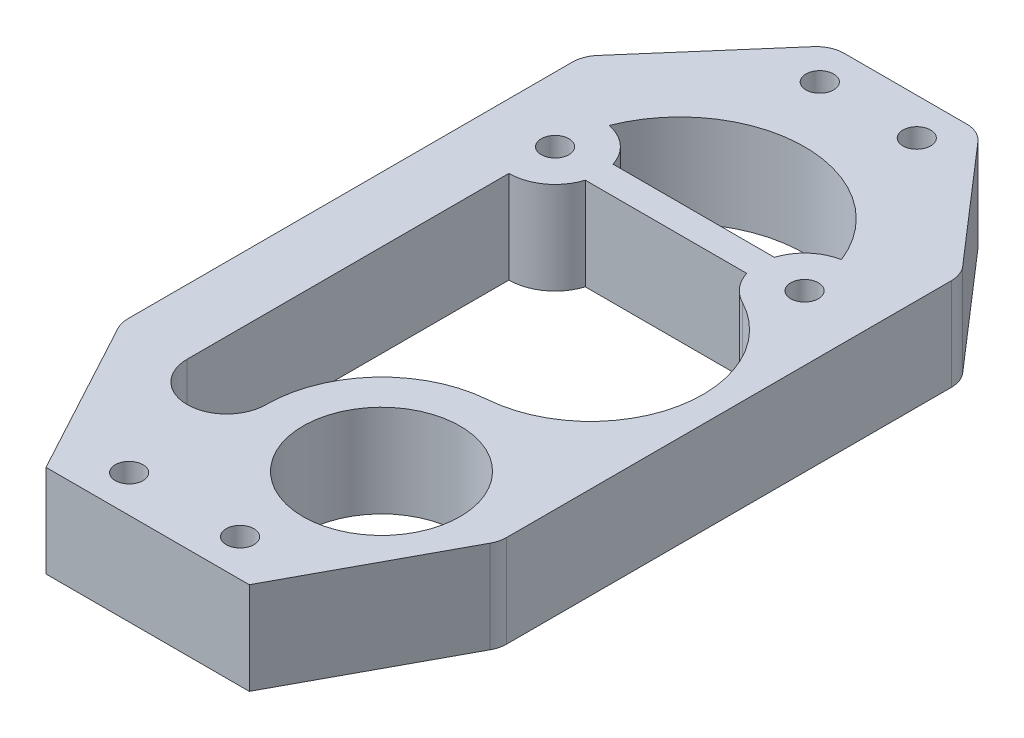
ISO-10303-21;
HEADER;
FILE_DESCRIPTION(('STEP AP214'),'2;1');
FILE_NAME('part.step','',(''),(''),'','','');
FILE_SCHEMA(('AUTOMOTIVE_DESIGN { 1 0 10303 214 1 1 1 1 }'));
ENDSEC;
DATA;
#1=APPLICATION_CONTEXT('core data for automotive mechanical design processes');
#2=APPLICATION_PROTOCOL_DEFINITION('international standard','automotive_design',2000,#1);
#3=PRODUCT_CONTEXT('',#1,'mechanical');
#4=PRODUCT('Part','Part','',(#3));
#5=PRODUCT_RELATED_PRODUCT_CATEGORY('part','',(#4));
#6=PRODUCT_DEFINITION_FORMATION('','',#4);
#7=PRODUCT_DEFINITION_CONTEXT('part definition',#1,'design');
#8=PRODUCT_DEFINITION('design','',#6,#7);
#9=PRODUCT_DEFINITION_SHAPE('','',#8);
#10=(LENGTH_UNIT() NAMED_UNIT(*) SI_UNIT(.MILLI.,.METRE.));
#11=(NAMED_UNIT(*) PLANE_ANGLE_UNIT() SI_UNIT($,.RADIAN.));
#12=(NAMED_UNIT(*) SI_UNIT($,.STERADIAN.) SOLID_ANGLE_UNIT());
#13=UNCERTAINTY_MEASURE_WITH_UNIT(LENGTH_MEASURE(1.E-05),#10,'distance_accuracy_value','');
#14=(GEOMETRIC_REPRESENTATION_CONTEXT(3) GLOBAL_UNCERTAINTY_ASSIGNED_CONTEXT((#13)) GLOBAL_UNIT_ASSIGNED_CONTEXT((#10,
#11,#12)) REPRESENTATION_CONTEXT('',''));
#15=CARTESIAN_POINT('',(0.,0.,0.));
#16=DIRECTION('',(0.,0.,1.));
#17=DIRECTION('',(1.,0.,0.));
#18=AXIS2_PLACEMENT_3D('',#15,#16,#17);
#19=CARTESIAN_POINT('',(0.,5.,0.));
#20=DIRECTION('',(0.,-1.,0.));
#21=DIRECTION('',(0.,0.,-1.));
#22=AXIS2_PLACEMENT_3D('',#19,#20,#21);
#23=PLANE('',#22);
#24=CARTESIAN_POINT('',(13.5,5.,0.));
#25=DIRECTION('',(0.,1.,0.));
#26=DIRECTION('',(0.,0.,1.));
#27=AXIS2_PLACEMENT_3D('',#24,#25,#26);
#28=CIRCLE('',#27,1.5);
#29=CARTESIAN_POINT('',(13.5,5.,1.5));
#30=VERTEX_POINT('',#29);
#31=EDGE_CURVE('E272',#30,#30,#28,.T.);
#32=ORIENTED_EDGE('',*,*,#31,.F.);
#33=EDGE_LOOP('',(#32));
#34=FACE_BOUND('',#33,.T.);
#35=CARTESIAN_POINT('',(-13.5,5.,0.));
#36=DIRECTION('',(0.,1.,0.));
#37=DIRECTION('',(0.,0.,1.));
#38=AXIS2_PLACEMENT_3D('',#35,#36,#37);
#39=CIRCLE('',#38,1.5);
#40=CARTESIAN_POINT('',(-13.5,5.,1.5));
#41=VERTEX_POINT('',#40);
#42=EDGE_CURVE('E278',#41,#41,#39,.T.);
#43=ORIENTED_EDGE('',*,*,#42,.F.);
#44=EDGE_LOOP('',(#43));
#45=FACE_BOUND('',#44,.T.);
#46=CARTESIAN_POINT('',(13.5,5.,0.));
#47=DIRECTION('',(0.,-1.,0.));
#48=DIRECTION('',(0.,0.,1.));
#49=AXIS2_PLACEMENT_3D('',#46,#47,#48);
#50=CIRCLE('',#49,5.);
#51=CARTESIAN_POINT('',(8.73030399291527,5.,-1.5));
#52=VERTEX_POINT('',#51);
#53=CARTESIAN_POINT('',(12.5740740740741,5.,-4.91351820793393));
#54=VERTEX_POINT('',#53);
#55=EDGE_CURVE('E284',#52,#54,#50,.T.);
#56=ORIENTED_EDGE('',*,*,#55,.F.);
#57=DIRECTION('',(1.,0.,0.));
#58=VECTOR('',#57,1.);
#59=CARTESIAN_POINT('',(8.73030399291527,5.,-1.5));
#60=LINE('',#59,#58);
#61=CARTESIAN_POINT('',(-8.73030399291527,5.,-1.5));
#62=VERTEX_POINT('',#61);
#63=EDGE_CURVE('E292',#62,#52,#60,.T.);
#64=ORIENTED_EDGE('',*,*,#63,.F.);
#65=CARTESIAN_POINT('',(-13.5,5.,0.));
#66=DIRECTION('',(0.,-1.,0.));
#67=DIRECTION('',(0.,0.,1.));
#68=AXIS2_PLACEMENT_3D('',#65,#66,#67);
#69=CIRCLE('',#68,5.);
#70=CARTESIAN_POINT('',(-12.5740740740741,5.,-4.91351820793393));
#71=VERTEX_POINT('',#70);
#72=EDGE_CURVE('E289',#71,#62,#69,.T.);
#73=ORIENTED_EDGE('',*,*,#72,.F.);
#74=CARTESIAN_POINT('',(0.,5.,0.));
#75=DIRECTION('',(0.,1.,0.));
#76=DIRECTION('',(0.,0.,1.));
#77=AXIS2_PLACEMENT_3D('',#74,#75,#76);
#78=CIRCLE('',#77,13.5);
#79=EDGE_CURVE('E286',#54,#71,#78,.T.);
#80=ORIENTED_EDGE('',*,*,#79,.F.);
#81=EDGE_LOOP('',(#56,#64,#73,#80));
#82=FACE_BOUND('',#81,.T.);
#83=DIRECTION('',(0.,0.,1.));
#84=VECTOR('',#83,1.);
#85=CARTESIAN_POINT('',(-20.5,5.,-10.));
#86=LINE('',#85,#84);
#87=CARTESIAN_POINT('',(-20.5,5.,-8.87956217000711));
#88=VERTEX_POINT('',#87);
#89=CARTESIAN_POINT('',(-20.5,5.,39.2420155495152));
#90=VERTEX_POINT('',#89);
#91=EDGE_CURVE('E356',#88,#90,#86,.T.);
#92=ORIENTED_EDGE('',*,*,#91,.T.);
#93=CARTESIAN_POINT('',(-17.5,5.,39.2420155495152));
#94=DIRECTION('',(0.,-1.,0.));
#95=DIRECTION('',(0.,0.,-1.));
#96=AXIS2_PLACEMENT_3D('',#93,#94,#95);
#97=CIRCLE('',#96,3.);
#98=CARTESIAN_POINT('',(-20.1399573860197,5.,40.6670155495152));
#99=VERTEX_POINT('',#98);
#100=EDGE_CURVE('E416',#90,#99,#97,.F.);
#101=ORIENTED_EDGE('',*,*,#100,.T.);
#102=DIRECTION('',(0.475,0.,0.879985795339902));
#103=VECTOR('',#102,1.);
#104=CARTESIAN_POINT('',(-20.5,5.,40.));
#105=LINE('',#104,#103);
#106=CARTESIAN_POINT('',(-11.,5.,57.5997159067981));
#107=VERTEX_POINT('',#106);
#108=EDGE_CURVE('E359',#99,#107,#105,.T.);
#109=ORIENTED_EDGE('',*,*,#108,.T.);
#110=DIRECTION('',(1.,0.,0.));
#111=VECTOR('',#110,1.);
#112=CARTESIAN_POINT('',(-11.,5.,57.5997159067981));
#113=LINE('',#112,#111);
#114=CARTESIAN_POINT('',(11.,5.,57.5997159067981));
#115=VERTEX_POINT('',#114);
#116=EDGE_CURVE('E339',#107,#115,#113,.T.);
#117=ORIENTED_EDGE('',*,*,#116,.T.);
#118=DIRECTION('',(0.475,0.,-0.879985795339902));
#119=VECTOR('',#118,1.);
#120=CARTESIAN_POINT('',(20.5,5.,40.));
#121=LINE('',#120,#119);
#122=CARTESIAN_POINT('',(20.1399573860197,5.,40.6670155495152));
#123=VERTEX_POINT('',#122);
#124=EDGE_CURVE('E342',#115,#123,#121,.T.);
#125=ORIENTED_EDGE('',*,*,#124,.T.);
#126=CARTESIAN_POINT('',(17.5,5.,39.2420155495152));
#127=DIRECTION('',(0.,-1.,0.));
#128=DIRECTION('',(0.,0.,-1.));
#129=AXIS2_PLACEMENT_3D('',#126,#127,#128);
#130=CIRCLE('',#129,3.);
#131=CARTESIAN_POINT('',(20.5,5.,39.2420155495152));
#132=VERTEX_POINT('',#131);
#133=EDGE_CURVE('E407',#123,#132,#130,.F.);
#134=ORIENTED_EDGE('',*,*,#133,.T.);
#135=DIRECTION('',(0.,0.,-1.));
#136=VECTOR('',#135,1.);
#137=CARTESIAN_POINT('',(20.5,5.,-10.));
#138=LINE('',#137,#136);
#139=CARTESIAN_POINT('',(20.5,5.,-8.87956217000711));
#140=VERTEX_POINT('',#139);
#141=EDGE_CURVE('E346',#132,#140,#138,.T.);
#142=ORIENTED_EDGE('',*,*,#141,.T.);
#143=CARTESIAN_POINT('',(17.5,5.,-8.87956217000711));
#144=DIRECTION('',(0.,-1.,0.));
#145=DIRECTION('',(0.,0.,-1.));
#146=AXIS2_PLACEMENT_3D('',#143,#144,#145);
#147=CIRCLE('',#146,3.);
#148=CARTESIAN_POINT('',(19.7655284444291,5.,-10.8461279246878));
#149=VERTEX_POINT('',#148);
#150=EDGE_CURVE('E409',#140,#149,#147,.F.);
#151=ORIENTED_EDGE('',*,*,#150,.T.);
#152=DIRECTION('',(-0.655521918226887,0.,-0.755176148143029));
#153=VECTOR('',#152,1.);
#154=CARTESIAN_POINT('',(8.,5.,-24.400284093202));
#155=LINE('',#154,#153);
#156=CARTESIAN_POINT('',(8.89706064011543,5.,-23.3668498478826));
#157=VERTEX_POINT('',#156);
#158=EDGE_CURVE('E349',#149,#157,#155,.T.);
#159=ORIENTED_EDGE('',*,*,#158,.T.);
#160=CARTESIAN_POINT('',(6.63153219568634,5.,-21.400284093202));
#161=DIRECTION('',(0.,-1.,0.));
#162=DIRECTION('',(0.,0.,-1.));
#163=AXIS2_PLACEMENT_3D('',#160,#161,#162);
#164=CIRCLE('',#163,3.);
#165=CARTESIAN_POINT('',(6.63153219568634,5.,-24.400284093202));
#166=VERTEX_POINT('',#165);
#167=EDGE_CURVE('E411',#157,#166,#164,.F.);
#168=ORIENTED_EDGE('',*,*,#167,.T.);
#169=DIRECTION('',(-1.,0.,0.));
#170=VECTOR('',#169,1.);
#171=CARTESIAN_POINT('',(8.,5.,-24.400284093202));
#172=LINE('',#171,#170);
#173=CARTESIAN_POINT('',(-6.63153219568634,5.,-24.400284093202));
#174=VERTEX_POINT('',#173);
#175=EDGE_CURVE('E352',#166,#174,#172,.T.);
#176=ORIENTED_EDGE('',*,*,#175,.T.);
#177=CARTESIAN_POINT('',(-6.63153219568634,5.,-21.400284093202));
#178=DIRECTION('',(0.,-1.,0.));
#179=DIRECTION('',(0.,0.,-1.));
#180=AXIS2_PLACEMENT_3D('',#177,#178,#179);
#181=CIRCLE('',#180,3.);
#182=CARTESIAN_POINT('',(-8.89706064011543,5.,-23.3668498478826));
#183=VERTEX_POINT('',#182);
#184=EDGE_CURVE('E59',#174,#183,#181,.F.);
#185=ORIENTED_EDGE('',*,*,#184,.T.);
#186=DIRECTION('',(-0.655521918226887,0.,0.755176148143029));
#187=VECTOR('',#186,1.);
#188=CARTESIAN_POINT('',(-8.,5.,-24.400284093202));
#189=LINE('',#188,#187);
#190=CARTESIAN_POINT('',(-19.7655284444291,5.,-10.8461279246878));
#191=VERTEX_POINT('',#190);
#192=EDGE_CURVE('E354',#183,#191,#189,.T.);
#193=ORIENTED_EDGE('',*,*,#192,.T.);
#194=CARTESIAN_POINT('',(-17.5,5.,-8.87956217000711));
#195=DIRECTION('',(0.,-1.,0.));
#196=DIRECTION('',(0.,0.,-1.));
#197=AXIS2_PLACEMENT_3D('',#194,#195,#196);
#198=CIRCLE('',#197,3.);
#199=EDGE_CURVE('E414',#191,#88,#198,.F.);
#200=ORIENTED_EDGE('',*,*,#199,.T.);
#201=EDGE_LOOP('',(#92,#101,#109,#117,#125,#134,#142,#151,#159,#168,#176,#185,#193,#200));
#202=FACE_BOUND('',#201,.T.);
#203=CARTESIAN_POINT('',(-5.25,5.,-20.3945458395131));
#204=DIRECTION('',(0.,1.,0.));
#205=DIRECTION('',(0.,0.,1.));
#206=AXIS2_PLACEMENT_3D('',#203,#204,#205);
#207=CIRCLE('',#206,1.5);
#208=CARTESIAN_POINT('',(-5.25,5.,-18.8945458395131));
#209=VERTEX_POINT('',#208);
#210=EDGE_CURVE('E333',#209,#209,#207,.T.);
#211=ORIENTED_EDGE('',*,*,#210,.F.);
#212=EDGE_LOOP('',(#211));
#213=FACE_BOUND('',#212,.T.);
#214=CARTESIAN_POINT('',(-6.,5.,53.5997159067981));
#215=DIRECTION('',(0.,1.,0.));
#216=DIRECTION('',(0.,0.,1.));
#217=AXIS2_PLACEMENT_3D('',#214,#215,#216);
#218=CIRCLE('',#217,1.5);
#219=CARTESIAN_POINT('',(-6.,5.,55.0997159067981));
#220=VERTEX_POINT('',#219);
#221=EDGE_CURVE('E327',#220,#220,#218,.T.);
#222=ORIENTED_EDGE('',*,*,#221,.F.);
#223=EDGE_LOOP('',(#222));
#224=FACE_BOUND('',#223,.T.);
#225=CARTESIAN_POINT('',(6.,5.,53.5997159067981));
#226=DIRECTION('',(0.,1.,0.));
#227=DIRECTION('',(0.,0.,-1.));
#228=AXIS2_PLACEMENT_3D('',#225,#226,#227);
#229=CIRCLE('',#228,1.5);
#230=CARTESIAN_POINT('',(6.,5.,52.0997159067981));
#231=VERTEX_POINT('',#230);
#232=EDGE_CURVE('E321',#231,#231,#229,.T.);
#233=ORIENTED_EDGE('',*,*,#232,.F.);
#234=EDGE_LOOP('',(#233));
#235=FACE_BOUND('',#234,.T.);
#236=CARTESIAN_POINT('',(5.25,5.,-20.3945458395131));
#237=DIRECTION('',(0.,1.,0.));
#238=DIRECTION('',(0.,0.,-1.));
#239=AXIS2_PLACEMENT_3D('',#236,#237,#238);
#240=CIRCLE('',#239,1.5);
#241=CARTESIAN_POINT('',(5.25,5.,-21.8945458395131));
#242=VERTEX_POINT('',#241);
#243=EDGE_CURVE('E315',#242,#242,#240,.T.);
#244=ORIENTED_EDGE('',*,*,#243,.F.);
#245=EDGE_LOOP('',(#244));
#246=FACE_BOUND('',#245,.T.);
#247=CARTESIAN_POINT('',(-9.23491832320444,5.,39.8174147720394));
#248=DIRECTION('',(0.,1.,0.));
#249=DIRECTION('',(0.,0.,1.));
#250=AXIS2_PLACEMENT_3D('',#247,#248,#249);
#251=CIRCLE('',#250,4.26508167679556);
#252=CARTESIAN_POINT('',(-13.5,5.,39.8174147720394));
#253=VERTEX_POINT('',#252);
#254=CARTESIAN_POINT('',(-4.96983664640887,5.,39.8174147720394));
#255=VERTEX_POINT('',#254);
#256=EDGE_CURVE('E206',#253,#255,#251,.T.);
#257=ORIENTED_EDGE('',*,*,#256,.F.);
#258=DIRECTION('',(0.,0.,1.));
#259=VECTOR('',#258,1.);
#260=CARTESIAN_POINT('',(-13.5,5.,5.));
#261=LINE('',#260,#259);
#262=CARTESIAN_POINT('',(-13.5,5.,5.));
#263=VERTEX_POINT('',#262);
#264=EDGE_CURVE('E242',#263,#253,#261,.T.);
#265=ORIENTED_EDGE('',*,*,#264,.F.);
#266=CARTESIAN_POINT('',(-13.5,5.,0.));
#267=DIRECTION('',(0.,-1.,0.));
#268=DIRECTION('',(0.,0.,1.));
#269=AXIS2_PLACEMENT_3D('',#266,#267,#268);
#270=CIRCLE('',#269,5.);
#271=CARTESIAN_POINT('',(-8.73030399291527,5.,1.5));
#272=VERTEX_POINT('',#271);
#273=EDGE_CURVE('E239',#272,#263,#270,.T.);
#274=ORIENTED_EDGE('',*,*,#273,.F.);
#275=DIRECTION('',(-1.,0.,0.));
#276=VECTOR('',#275,1.);
#277=CARTESIAN_POINT('',(8.73030399291527,5.,1.5));
#278=LINE('',#277,#276);
#279=CARTESIAN_POINT('',(8.73030399291527,5.,1.5));
#280=VERTEX_POINT('',#279);
#281=EDGE_CURVE('E237',#280,#272,#278,.T.);
#282=ORIENTED_EDGE('',*,*,#281,.F.);
#283=CARTESIAN_POINT('',(13.5,5.,0.));
#284=DIRECTION('',(0.,-1.,0.));
#285=DIRECTION('',(0.,0.,1.));
#286=AXIS2_PLACEMENT_3D('',#283,#284,#285);
#287=CIRCLE('',#286,5.);
#288=CARTESIAN_POINT('',(11.1879757809718,5.,4.43334456258784));
#289=VERTEX_POINT('',#288);
#290=EDGE_CURVE('E232',#289,#280,#287,.T.);
#291=ORIENTED_EDGE('',*,*,#290,.F.);
#292=CARTESIAN_POINT('',(5.55999374493785,5.,15.2250929155878));
#293=DIRECTION('',(0.,1.,0.));
#294=DIRECTION('',(0.,0.,1.));
#295=AXIS2_PLACEMENT_3D('',#292,#293,#294);
#296=CIRCLE('',#295,12.1711139306309);
#297=CARTESIAN_POINT('',(6.53194656543105,5.,27.3573359904331));
#298=VERTEX_POINT('',#297);
#299=EDGE_CURVE('E230',#298,#289,#296,.T.);
#300=ORIENTED_EDGE('',*,*,#299,.F.);
#301=CARTESIAN_POINT('',(7.53016335359115,5.,39.8174147720394));
#302=DIRECTION('',(0.,-1.,0.));
#303=DIRECTION('',(0.,0.,-1.));
#304=AXIS2_PLACEMENT_3D('',#301,#302,#303);
#305=CIRCLE('',#304,12.5);
#306=EDGE_CURVE('E216',#255,#298,#305,.T.);
#307=ORIENTED_EDGE('',*,*,#306,.F.);
#308=EDGE_LOOP('',(#257,#265,#274,#282,#291,#300,#307));
#309=FACE_BOUND('',#308,.T.);
#310=CARTESIAN_POINT('',(7.53016335359115,5.,39.8174147720394));
#311=DIRECTION('',(0.,1.,0.));
#312=DIRECTION('',(0.,0.,1.));
#313=AXIS2_PLACEMENT_3D('',#310,#311,#312);
#314=CIRCLE('',#313,8.5);
#315=CARTESIAN_POINT('',(7.53016335359115,5.,48.3174147720394));
#316=VERTEX_POINT('',#315);
#317=EDGE_CURVE('E246',#316,#316,#314,.T.);
#318=ORIENTED_EDGE('',*,*,#317,.F.);
#319=EDGE_LOOP('',(#318));
#320=FACE_BOUND('',#319,.T.);
#321=ADVANCED_FACE('F37',(#34,#45,#82,#202,#213,#224,#235,#246,#309,#320),#23,.F.);
#322=CARTESIAN_POINT('',(0.,-5.,0.));
#323=DIRECTION('',(0.,-1.,0.));
#324=DIRECTION('',(0.,0.,-1.));
#325=AXIS2_PLACEMENT_3D('',#322,#323,#324);
#326=PLANE('',#325);
#327=DIRECTION('',(0.,0.,1.));
#328=VECTOR('',#327,1.);
#329=CARTESIAN_POINT('',(-13.5,-5.,5.));
#330=LINE('',#329,#328);
#331=CARTESIAN_POINT('',(-13.5,-5.,5.));
#332=VERTEX_POINT('',#331);
#333=CARTESIAN_POINT('',(-13.5,-5.,39.8174147720394));
#334=VERTEX_POINT('',#333);
#335=EDGE_CURVE('E217',#332,#334,#330,.T.);
#336=ORIENTED_EDGE('',*,*,#335,.T.);
#337=CARTESIAN_POINT('',(-9.23491832320444,-5.,39.8174147720394));
#338=DIRECTION('',(0.,1.,0.));
#339=DIRECTION('',(0.,0.,1.));
#340=AXIS2_PLACEMENT_3D('',#337,#338,#339);
#341=CIRCLE('',#340,4.26508167679556);
#342=CARTESIAN_POINT('',(-4.96983664640887,-5.,39.8174147720394));
#343=VERTEX_POINT('',#342);
#344=EDGE_CURVE('E244',#334,#343,#341,.T.);
#345=ORIENTED_EDGE('',*,*,#344,.T.);
#346=CARTESIAN_POINT('',(7.53016335359115,-5.,39.8174147720394));
#347=DIRECTION('',(0.,-1.,0.));
#348=DIRECTION('',(0.,0.,-1.));
#349=AXIS2_PLACEMENT_3D('',#346,#347,#348);
#350=CIRCLE('',#349,12.5);
#351=CARTESIAN_POINT('',(6.53194656543105,-5.,27.3573359904331));
#352=VERTEX_POINT('',#351);
#353=EDGE_CURVE('E223',#343,#352,#350,.T.);
#354=ORIENTED_EDGE('',*,*,#353,.T.);
#355=CARTESIAN_POINT('',(5.55999374493785,-5.,15.2250929155878));
#356=DIRECTION('',(0.,1.,0.));
#357=DIRECTION('',(0.,0.,1.));
#358=AXIS2_PLACEMENT_3D('',#355,#356,#357);
#359=CIRCLE('',#358,12.1711139306309);
#360=CARTESIAN_POINT('',(11.1879757809718,-5.,4.43334456258784));
#361=VERTEX_POINT('',#360);
#362=EDGE_CURVE('E248',#352,#361,#359,.T.);
#363=ORIENTED_EDGE('',*,*,#362,.T.);
#364=CARTESIAN_POINT('',(13.5,-5.,0.));
#365=DIRECTION('',(0.,-1.,0.));
#366=DIRECTION('',(0.,0.,1.));
#367=AXIS2_PLACEMENT_3D('',#364,#365,#366);
#368=CIRCLE('',#367,5.);
#369=CARTESIAN_POINT('',(8.73030399291527,-5.,1.5));
#370=VERTEX_POINT('',#369);
#371=EDGE_CURVE('E251',#361,#370,#368,.T.);
#372=ORIENTED_EDGE('',*,*,#371,.T.);
#373=DIRECTION('',(-1.,0.,0.));
#374=VECTOR('',#373,1.);
#375=CARTESIAN_POINT('',(8.73030399291527,-5.,1.5));
#376=LINE('',#375,#374);
#377=CARTESIAN_POINT('',(-8.73030399291527,-5.,1.5));
#378=VERTEX_POINT('',#377);
#379=EDGE_CURVE('E254',#370,#378,#376,.T.);
#380=ORIENTED_EDGE('',*,*,#379,.T.);
#381=CARTESIAN_POINT('',(-13.5,-5.,0.));
#382=DIRECTION('',(0.,-1.,0.));
#383=DIRECTION('',(0.,0.,1.));
#384=AXIS2_PLACEMENT_3D('',#381,#382,#383);
#385=CIRCLE('',#384,5.);
#386=EDGE_CURVE('E257',#378,#332,#385,.T.);
#387=ORIENTED_EDGE('',*,*,#386,.T.);
#388=EDGE_LOOP('',(#336,#345,#354,#363,#372,#380,#387));
#389=FACE_BOUND('',#388,.T.);
#390=CARTESIAN_POINT('',(13.5,-5.,0.));
#391=DIRECTION('',(0.,1.,0.));
#392=DIRECTION('',(0.,0.,1.));
#393=AXIS2_PLACEMENT_3D('',#390,#391,#392);
#394=CIRCLE('',#393,1.5);
#395=CARTESIAN_POINT('',(13.5,-5.,1.5));
#396=VERTEX_POINT('',#395);
#397=EDGE_CURVE('E224',#396,#396,#394,.T.);
#398=ORIENTED_EDGE('',*,*,#397,.T.);
#399=EDGE_LOOP('',(#398));
#400=FACE_BOUND('',#399,.T.);
#401=DIRECTION('',(1.,0.,0.));
#402=VECTOR('',#401,1.);
#403=CARTESIAN_POINT('',(8.73030399291527,-5.,-1.5));
#404=LINE('',#403,#402);
#405=CARTESIAN_POINT('',(-8.73030399291527,-5.,-1.5));
#406=VERTEX_POINT('',#405);
#407=CARTESIAN_POINT('',(8.73030399291527,-5.,-1.5));
#408=VERTEX_POINT('',#407);
#409=EDGE_CURVE('E287',#406,#408,#404,.T.);
#410=ORIENTED_EDGE('',*,*,#409,.T.);
#411=CARTESIAN_POINT('',(13.5,-5.,0.));
#412=DIRECTION('',(0.,-1.,0.));
#413=DIRECTION('',(0.,0.,1.));
#414=AXIS2_PLACEMENT_3D('',#411,#412,#413);
#415=CIRCLE('',#414,5.);
#416=CARTESIAN_POINT('',(12.5740740740741,-5.,-4.91351820793393));
#417=VERTEX_POINT('',#416);
#418=EDGE_CURVE('E281',#408,#417,#415,.T.);
#419=ORIENTED_EDGE('',*,*,#418,.T.);
#420=CARTESIAN_POINT('',(0.,-5.,0.));
#421=DIRECTION('',(0.,1.,0.));
#422=DIRECTION('',(0.,0.,1.));
#423=AXIS2_PLACEMENT_3D('',#420,#421,#422);
#424=CIRCLE('',#423,13.5);
#425=CARTESIAN_POINT('',(-12.5740740740741,-5.,-4.91351820793393));
#426=VERTEX_POINT('',#425);
#427=EDGE_CURVE('E297',#417,#426,#424,.T.);
#428=ORIENTED_EDGE('',*,*,#427,.T.);
#429=CARTESIAN_POINT('',(-13.5,-5.,0.));
#430=DIRECTION('',(0.,-1.,0.));
#431=DIRECTION('',(0.,0.,1.));
#432=AXIS2_PLACEMENT_3D('',#429,#430,#431);
#433=CIRCLE('',#432,5.);
#434=EDGE_CURVE('E300',#426,#406,#433,.T.);
#435=ORIENTED_EDGE('',*,*,#434,.T.);
#436=EDGE_LOOP('',(#410,#419,#428,#435));
#437=FACE_BOUND('',#436,.T.);
#438=CARTESIAN_POINT('',(5.25,-5.,-20.3945458395131));
#439=DIRECTION('',(0.,1.,0.));
#440=DIRECTION('',(0.,0.,-1.));
#441=AXIS2_PLACEMENT_3D('',#438,#439,#440);
#442=CIRCLE('',#441,1.5);
#443=CARTESIAN_POINT('',(5.25,-5.,-21.8945458395131));
#444=VERTEX_POINT('',#443);
#445=EDGE_CURVE('E314',#444,#444,#442,.T.);
#446=ORIENTED_EDGE('',*,*,#445,.T.);
#447=EDGE_LOOP('',(#446));
#448=FACE_BOUND('',#447,.T.);
#449=CARTESIAN_POINT('',(-6.,-5.,53.5997159067981));
#450=DIRECTION('',(0.,1.,0.));
#451=DIRECTION('',(0.,0.,1.));
#452=AXIS2_PLACEMENT_3D('',#449,#450,#451);
#453=CIRCLE('',#452,1.5);
#454=CARTESIAN_POINT('',(-6.,-5.,55.0997159067981));
#455=VERTEX_POINT('',#454);
#456=EDGE_CURVE('E324',#455,#455,#453,.T.);
#457=ORIENTED_EDGE('',*,*,#456,.T.);
#458=EDGE_LOOP('',(#457));
#459=FACE_BOUND('',#458,.T.);
#460=DIRECTION('',(0.475,0.,0.879985795339902));
#461=VECTOR('',#460,1.);
#462=CARTESIAN_POINT('',(-20.5,-5.,40.));
#463=LINE('',#462,#461);
#464=CARTESIAN_POINT('',(-20.1399573860197,-5.,40.6670155495152));
#465=VERTEX_POINT('',#464);
#466=CARTESIAN_POINT('',(-11.,-5.,57.5997159067981));
#467=VERTEX_POINT('',#466);
#468=EDGE_CURVE('E343',#465,#467,#463,.T.);
#469=ORIENTED_EDGE('',*,*,#468,.F.);
#470=CARTESIAN_POINT('',(-17.5,-5.,39.2420155495152));
#471=DIRECTION('',(0.,-1.,0.));
#472=DIRECTION('',(0.,0.,-1.));
#473=AXIS2_PLACEMENT_3D('',#470,#471,#472);
#474=CIRCLE('',#473,3.);
#475=CARTESIAN_POINT('',(-20.5,-5.,39.2420155495152));
#476=VERTEX_POINT('',#475);
#477=EDGE_CURVE('E400',#465,#476,#474,.T.);
#478=ORIENTED_EDGE('',*,*,#477,.T.);
#479=DIRECTION('',(0.,0.,1.));
#480=VECTOR('',#479,1.);
#481=CARTESIAN_POINT('',(-20.5,-5.,-10.));
#482=LINE('',#481,#480);
#483=CARTESIAN_POINT('',(-20.5,-5.,-8.87956217000711));
#484=VERTEX_POINT('',#483);
#485=EDGE_CURVE('E378',#484,#476,#482,.T.);
#486=ORIENTED_EDGE('',*,*,#485,.F.);
#487=CARTESIAN_POINT('',(-17.5,-5.,-8.87956217000711));
#488=DIRECTION('',(0.,-1.,0.));
#489=DIRECTION('',(0.,0.,-1.));
#490=AXIS2_PLACEMENT_3D('',#487,#488,#489);
#491=CIRCLE('',#490,3.);
#492=CARTESIAN_POINT('',(-19.7655284444291,-5.,-10.8461279246878));
#493=VERTEX_POINT('',#492);
#494=EDGE_CURVE('E398',#484,#493,#491,.T.);
#495=ORIENTED_EDGE('',*,*,#494,.T.);
#496=DIRECTION('',(-0.655521918226887,0.,0.755176148143029));
#497=VECTOR('',#496,1.);
#498=CARTESIAN_POINT('',(-8.,-5.,-24.400284093202));
#499=LINE('',#498,#497);
#500=CARTESIAN_POINT('',(-8.89706064011543,-5.,-23.3668498478826));
#501=VERTEX_POINT('',#500);
#502=EDGE_CURVE('E376',#501,#493,#499,.T.);
#503=ORIENTED_EDGE('',*,*,#502,.F.);
#504=CARTESIAN_POINT('',(-6.63153219568634,-5.,-21.400284093202));
#505=DIRECTION('',(0.,-1.,0.));
#506=DIRECTION('',(0.,0.,-1.));
#507=AXIS2_PLACEMENT_3D('',#504,#505,#506);
#508=CIRCLE('',#507,3.);
#509=CARTESIAN_POINT('',(-6.63153219568634,-5.,-24.400284093202));
#510=VERTEX_POINT('',#509);
#511=EDGE_CURVE('E396',#501,#510,#508,.T.);
#512=ORIENTED_EDGE('',*,*,#511,.T.);
#513=DIRECTION('',(-1.,0.,0.));
#514=VECTOR('',#513,1.);
#515=CARTESIAN_POINT('',(8.,-5.,-24.400284093202));
#516=LINE('',#515,#514);
#517=CARTESIAN_POINT('',(6.63153219568634,-5.,-24.400284093202));
#518=VERTEX_POINT('',#517);
#519=EDGE_CURVE('E373',#518,#510,#516,.T.);
#520=ORIENTED_EDGE('',*,*,#519,.F.);
#521=CARTESIAN_POINT('',(6.63153219568634,-5.,-21.400284093202));
#522=DIRECTION('',(0.,-1.,0.));
#523=DIRECTION('',(0.,0.,-1.));
#524=AXIS2_PLACEMENT_3D('',#521,#522,#523);
#525=CIRCLE('',#524,3.);
#526=CARTESIAN_POINT('',(8.89706064011543,-5.,-23.3668498478826));
#527=VERTEX_POINT('',#526);
#528=EDGE_CURVE('E394',#518,#527,#525,.T.);
#529=ORIENTED_EDGE('',*,*,#528,.T.);
#530=DIRECTION('',(-0.655521918226887,0.,-0.755176148143029));
#531=VECTOR('',#530,1.);
#532=CARTESIAN_POINT('',(8.,-5.,-24.400284093202));
#533=LINE('',#532,#531);
#534=CARTESIAN_POINT('',(19.7655284444291,-5.,-10.8461279246878));
#535=VERTEX_POINT('',#534);
#536=EDGE_CURVE('E370',#535,#527,#533,.T.);
#537=ORIENTED_EDGE('',*,*,#536,.F.);
#538=CARTESIAN_POINT('',(17.5,-5.,-8.87956217000711));
#539=DIRECTION('',(0.,-1.,0.));
#540=DIRECTION('',(0.,0.,-1.));
#541=AXIS2_PLACEMENT_3D('',#538,#539,#540);
#542=CIRCLE('',#541,3.);
#543=CARTESIAN_POINT('',(20.5,-5.,-8.87956217000711));
#544=VERTEX_POINT('',#543);
#545=EDGE_CURVE('E392',#535,#544,#542,.T.);
#546=ORIENTED_EDGE('',*,*,#545,.T.);
#547=DIRECTION('',(0.,0.,-1.));
#548=VECTOR('',#547,1.);
#549=CARTESIAN_POINT('',(20.5,-5.,-10.));
#550=LINE('',#549,#548);
#551=CARTESIAN_POINT('',(20.5,-5.,39.2420155495152));
#552=VERTEX_POINT('',#551);
#553=EDGE_CURVE('E367',#552,#544,#550,.T.);
#554=ORIENTED_EDGE('',*,*,#553,.F.);
#555=CARTESIAN_POINT('',(17.5,-5.,39.2420155495152));
#556=DIRECTION('',(0.,-1.,0.));
#557=DIRECTION('',(0.,0.,-1.));
#558=AXIS2_PLACEMENT_3D('',#555,#556,#557);
#559=CIRCLE('',#558,3.);
#560=CARTESIAN_POINT('',(20.1399573860197,-5.,40.6670155495152));
#561=VERTEX_POINT('',#560);
#562=EDGE_CURVE('E390',#552,#561,#559,.T.);
#563=ORIENTED_EDGE('',*,*,#562,.T.);
#564=DIRECTION('',(0.475,0.,-0.879985795339902));
#565=VECTOR('',#564,1.);
#566=CARTESIAN_POINT('',(20.5,-5.,40.));
#567=LINE('',#566,#565);
#568=CARTESIAN_POINT('',(11.,-5.,57.5997159067981));
#569=VERTEX_POINT('',#568);
#570=EDGE_CURVE('E364',#569,#561,#567,.T.);
#571=ORIENTED_EDGE('',*,*,#570,.F.);
#572=DIRECTION('',(1.,0.,0.));
#573=VECTOR('',#572,1.);
#574=CARTESIAN_POINT('',(-11.,-5.,57.5997159067981));
#575=LINE('',#574,#573);
#576=EDGE_CURVE('E336',#467,#569,#575,.T.);
#577=ORIENTED_EDGE('',*,*,#576,.F.);
#578=EDGE_LOOP('',(#469,#478,#486,#495,#503,#512,#520,#529,#537,#546,#554,#563,#571,#577));
#579=FACE_BOUND('',#578,.T.);
#580=CARTESIAN_POINT('',(-5.25,-5.,-20.3945458395131));
#581=DIRECTION('',(0.,1.,0.));
#582=DIRECTION('',(0.,0.,1.));
#583=AXIS2_PLACEMENT_3D('',#580,#581,#582);
#584=CIRCLE('',#583,1.5);
#585=CARTESIAN_POINT('',(-5.25,-5.,-18.8945458395131));
#586=VERTEX_POINT('',#585);
#587=EDGE_CURVE('E330',#586,#586,#584,.T.);
#588=ORIENTED_EDGE('',*,*,#587,.T.);
#589=EDGE_LOOP('',(#588));
#590=FACE_BOUND('',#589,.T.);
#591=CARTESIAN_POINT('',(6.,-5.,53.5997159067981));
#592=DIRECTION('',(0.,1.,0.));
#593=DIRECTION('',(0.,0.,-1.));
#594=AXIS2_PLACEMENT_3D('',#591,#592,#593);
#595=CIRCLE('',#594,1.5);
#596=CARTESIAN_POINT('',(6.,-5.,52.0997159067981));
#597=VERTEX_POINT('',#596);
#598=EDGE_CURVE('E318',#597,#597,#595,.T.);
#599=ORIENTED_EDGE('',*,*,#598,.T.);
#600=EDGE_LOOP('',(#599));
#601=FACE_BOUND('',#600,.T.);
#602=CARTESIAN_POINT('',(-13.5,-5.,0.));
#603=DIRECTION('',(0.,1.,0.));
#604=DIRECTION('',(0.,0.,1.));
#605=AXIS2_PLACEMENT_3D('',#602,#603,#604);
#606=CIRCLE('',#605,1.5);
#607=CARTESIAN_POINT('',(-13.5,-5.,1.5));
#608=VERTEX_POINT('',#607);
#609=EDGE_CURVE('E275',#608,#608,#606,.T.);
#610=ORIENTED_EDGE('',*,*,#609,.T.);
#611=EDGE_LOOP('',(#610));
#612=FACE_BOUND('',#611,.T.);
#613=CARTESIAN_POINT('',(7.53016335359115,-5.,39.8174147720394));
#614=DIRECTION('',(0.,1.,0.));
#615=DIRECTION('',(0.,0.,1.));
#616=AXIS2_PLACEMENT_3D('',#613,#614,#615);
#617=CIRCLE('',#616,8.5);
#618=CARTESIAN_POINT('',(7.53016335359115,-5.,48.3174147720394));
#619=VERTEX_POINT('',#618);
#620=EDGE_CURVE('E806',#619,#619,#617,.T.);
#621=ORIENTED_EDGE('',*,*,#620,.T.);
#622=EDGE_LOOP('',(#621));
#623=FACE_BOUND('',#622,.T.);
#624=ADVANCED_FACE('F453',(#389,#400,#437,#448,#459,#579,#590,#601,#612,#623),#326,.T.);
#625=CARTESIAN_POINT('',(-11.,5.,57.5997159067981));
#626=DIRECTION('',(0.,0.,-1.));
#627=DIRECTION('',(-1.,0.,0.));
#628=AXIS2_PLACEMENT_3D('',#625,#626,#627);
#629=PLANE('',#628);
#630=ORIENTED_EDGE('',*,*,#576,.T.);
#631=DIRECTION('',(0.,-1.,0.));
#632=VECTOR('',#631,1.);
#633=CARTESIAN_POINT('',(11.,5.,57.5997159067981));
#634=LINE('',#633,#632);
#635=EDGE_CURVE('E384',#115,#569,#634,.T.);
#636=ORIENTED_EDGE('',*,*,#635,.F.);
#637=ORIENTED_EDGE('',*,*,#116,.F.);
#638=DIRECTION('',(0.,-1.,0.));
#639=VECTOR('',#638,1.);
#640=CARTESIAN_POINT('',(-11.,5.,57.5997159067981));
#641=LINE('',#640,#639);
#642=EDGE_CURVE('E361',#107,#467,#641,.T.);
#643=ORIENTED_EDGE('',*,*,#642,.T.);
#644=EDGE_LOOP('',(#630,#636,#637,#643));
#645=FACE_BOUND('',#644,.T.);
#646=ADVANCED_FACE('F489',(#645),#629,.F.);
#647=CARTESIAN_POINT('',(20.5,5.,40.));
#648=DIRECTION('',(-0.879985795339902,0.,-0.475));
#649=DIRECTION('',(-0.475,0.,0.879985795339902));
#650=AXIS2_PLACEMENT_3D('',#647,#648,#649);
#651=PLANE('',#650);
#652=ORIENTED_EDGE('',*,*,#570,.T.);
#653=DIRECTION('',(0.,-1.,0.));
#654=VECTOR('',#653,1.);
#655=CARTESIAN_POINT('',(20.1399573860197,5.,40.6670155495152));
#656=LINE('',#655,#654);
#657=EDGE_CURVE('E11',#561,#123,#656,.F.);
#658=ORIENTED_EDGE('',*,*,#657,.T.);
#659=ORIENTED_EDGE('',*,*,#124,.F.);
#660=ORIENTED_EDGE('',*,*,#635,.T.);
#661=EDGE_LOOP('',(#652,#658,#659,#660));
#662=FACE_BOUND('',#661,.T.);
#663=ADVANCED_FACE('F494',(#662),#651,.F.);
#664=CARTESIAN_POINT('',(20.5,5.,-10.));
#665=DIRECTION('',(-1.,0.,0.));
#666=DIRECTION('',(0.,0.,1.));
#667=AXIS2_PLACEMENT_3D('',#664,#665,#666);
#668=PLANE('',#667);
#669=ORIENTED_EDGE('',*,*,#553,.T.);
#670=DIRECTION('',(0.,-1.,0.));
#671=VECTOR('',#670,1.);
#672=CARTESIAN_POINT('',(20.5,5.,-8.87956217000711));
#673=LINE('',#672,#671);
#674=EDGE_CURVE('E45',#544,#140,#673,.F.);
#675=ORIENTED_EDGE('',*,*,#674,.T.);
#676=ORIENTED_EDGE('',*,*,#141,.F.);
#677=DIRECTION('',(0.,-1.,0.));
#678=VECTOR('',#677,1.);
#679=CARTESIAN_POINT('',(20.5,5.,39.2420155495152));
#680=LINE('',#679,#678);
#681=EDGE_CURVE('E432',#132,#552,#680,.T.);
#682=ORIENTED_EDGE('',*,*,#681,.T.);
#683=EDGE_LOOP('',(#669,#675,#676,#682));
#684=FACE_BOUND('',#683,.T.);
#685=ADVANCED_FACE('F437',(#684),#668,.F.);
#686=CARTESIAN_POINT('',(8.,5.,-24.400284093202));
#687=DIRECTION('',(-0.755176148143029,0.,0.655521918226887));
#688=DIRECTION('',(0.655521918226887,0.,0.755176148143029));
#689=AXIS2_PLACEMENT_3D('',#686,#687,#688);
#690=PLANE('',#689);
#691=ORIENTED_EDGE('',*,*,#536,.T.);
#692=DIRECTION('',(0.,-1.,0.));
#693=VECTOR('',#692,1.);
#694=CARTESIAN_POINT('',(8.89706064011543,5.,-23.3668498478826));
#695=LINE('',#694,#693);
#696=EDGE_CURVE('E430',#527,#157,#695,.F.);
#697=ORIENTED_EDGE('',*,*,#696,.T.);
#698=ORIENTED_EDGE('',*,*,#158,.F.);
#699=DIRECTION('',(0.,-1.,0.));
#700=VECTOR('',#699,1.);
#701=CARTESIAN_POINT('',(19.7655284444291,5.,-10.8461279246878));
#702=LINE('',#701,#700);
#703=EDGE_CURVE('E427',#149,#535,#702,.T.);
#704=ORIENTED_EDGE('',*,*,#703,.T.);
#705=EDGE_LOOP('',(#691,#697,#698,#704));
#706=FACE_BOUND('',#705,.T.);
#707=ADVANCED_FACE('F449',(#706),#690,.F.);
#708=CARTESIAN_POINT('',(8.,5.,-24.400284093202));
#709=DIRECTION('',(0.,0.,1.));
#710=DIRECTION('',(1.,0.,0.));
#711=AXIS2_PLACEMENT_3D('',#708,#709,#710);
#712=PLANE('',#711);
#713=ORIENTED_EDGE('',*,*,#519,.T.);
#714=DIRECTION('',(0.,-1.,0.));
#715=VECTOR('',#714,1.);
#716=CARTESIAN_POINT('',(-6.63153219568634,5.,-24.400284093202));
#717=LINE('',#716,#715);
#718=EDGE_CURVE('E425',#510,#174,#717,.F.);
#719=ORIENTED_EDGE('',*,*,#718,.T.);
#720=ORIENTED_EDGE('',*,*,#175,.F.);
#721=DIRECTION('',(0.,-1.,0.));
#722=VECTOR('',#721,1.);
#723=CARTESIAN_POINT('',(6.63153219568634,5.,-24.400284093202));
#724=LINE('',#723,#722);
#725=EDGE_CURVE('E422',#166,#518,#724,.T.);
#726=ORIENTED_EDGE('',*,*,#725,.T.);
#727=EDGE_LOOP('',(#713,#719,#720,#726));
#728=FACE_BOUND('',#727,.T.);
#729=ADVANCED_FACE('F462',(#728),#712,.F.);
#730=CARTESIAN_POINT('',(-8.,5.,-24.400284093202));
#731=DIRECTION('',(0.755176148143029,0.,0.655521918226887));
#732=DIRECTION('',(0.655521918226887,0.,-0.75517614814303));
#733=AXIS2_PLACEMENT_3D('',#730,#731,#732);
#734=PLANE('',#733);
#735=ORIENTED_EDGE('',*,*,#502,.T.);
#736=DIRECTION('',(0.,-1.,0.));
#737=VECTOR('',#736,1.);
#738=CARTESIAN_POINT('',(-19.7655284444291,5.,-10.8461279246878));
#739=LINE('',#738,#737);
#740=EDGE_CURVE('E52',#493,#191,#739,.F.);
#741=ORIENTED_EDGE('',*,*,#740,.T.);
#742=ORIENTED_EDGE('',*,*,#192,.F.);
#743=DIRECTION('',(0.,-1.,0.));
#744=VECTOR('',#743,1.);
#745=CARTESIAN_POINT('',(-8.89706064011543,5.,-23.3668498478826));
#746=LINE('',#745,#744);
#747=EDGE_CURVE('E418',#183,#501,#746,.T.);
#748=ORIENTED_EDGE('',*,*,#747,.T.);
#749=EDGE_LOOP('',(#735,#741,#742,#748));
#750=FACE_BOUND('',#749,.T.);
#751=ADVANCED_FACE('F468',(#750),#734,.F.);
#752=CARTESIAN_POINT('',(-20.5,5.,-10.));
#753=DIRECTION('',(1.,0.,0.));
#754=DIRECTION('',(0.,0.,-1.));
#755=AXIS2_PLACEMENT_3D('',#752,#753,#754);
#756=PLANE('',#755);
#757=ORIENTED_EDGE('',*,*,#485,.T.);
#758=DIRECTION('',(0.,-1.,0.));
#759=VECTOR('',#758,1.);
#760=CARTESIAN_POINT('',(-20.5,5.,39.2420155495152));
#761=LINE('',#760,#759);
#762=EDGE_CURVE('E405',#476,#90,#761,.F.);
#763=ORIENTED_EDGE('',*,*,#762,.T.);
#764=ORIENTED_EDGE('',*,*,#91,.F.);
#765=DIRECTION('',(0.,-1.,0.));
#766=VECTOR('',#765,1.);
#767=CARTESIAN_POINT('',(-20.5,5.,-8.87956217000711));
#768=LINE('',#767,#766);
#769=EDGE_CURVE('E402',#88,#484,#768,.T.);
#770=ORIENTED_EDGE('',*,*,#769,.T.);
#771=EDGE_LOOP('',(#757,#763,#764,#770));
#772=FACE_BOUND('',#771,.T.);
#773=ADVANCED_FACE('F476',(#772),#756,.F.);
#774=CARTESIAN_POINT('',(-20.5,5.,40.));
#775=DIRECTION('',(0.879985795339902,0.,-0.475));
#776=DIRECTION('',(-0.475,0.,-0.879985795339902));
#777=AXIS2_PLACEMENT_3D('',#774,#775,#776);
#778=PLANE('',#777);
#779=ORIENTED_EDGE('',*,*,#108,.F.);
#780=DIRECTION('',(0.,-1.,0.));
#781=VECTOR('',#780,1.);
#782=CARTESIAN_POINT('',(-20.1399573860197,5.,40.6670155495152));
#783=LINE('',#782,#781);
#784=EDGE_CURVE('E387',#99,#465,#783,.T.);
#785=ORIENTED_EDGE('',*,*,#784,.T.);
#786=ORIENTED_EDGE('',*,*,#468,.T.);
#787=ORIENTED_EDGE('',*,*,#642,.F.);
#788=EDGE_LOOP('',(#779,#785,#786,#787));
#789=FACE_BOUND('',#788,.T.);
#790=ADVANCED_FACE('F484',(#789),#778,.F.);
#791=CARTESIAN_POINT('',(-5.25,5.,-20.3945458395131));
#792=DIRECTION('',(0.,-1.,0.));
#793=DIRECTION('',(0.,0.,-1.));
#794=AXIS2_PLACEMENT_3D('',#791,#792,#793);
#795=CYLINDRICAL_SURFACE('',#794,1.5);
#796=ORIENTED_EDGE('',*,*,#210,.T.);
#797=EDGE_LOOP('',(#796));
#798=FACE_BOUND('',#797,.T.);
#799=ORIENTED_EDGE('',*,*,#587,.F.);
#800=EDGE_LOOP('',(#799));
#801=FACE_BOUND('',#800,.T.);
#802=ADVANCED_FACE('F514',(#798,#801),#795,.F.);
#803=CARTESIAN_POINT('',(-6.,5.,53.5997159067981));
#804=DIRECTION('',(0.,-1.,0.));
#805=DIRECTION('',(0.,0.,-1.));
#806=AXIS2_PLACEMENT_3D('',#803,#804,#805);
#807=CYLINDRICAL_SURFACE('',#806,1.5);
#808=ORIENTED_EDGE('',*,*,#221,.T.);
#809=EDGE_LOOP('',(#808));
#810=FACE_BOUND('',#809,.T.);
#811=ORIENTED_EDGE('',*,*,#456,.F.);
#812=EDGE_LOOP('',(#811));
#813=FACE_BOUND('',#812,.T.);
#814=ADVANCED_FACE('F553',(#810,#813),#807,.F.);
#815=CARTESIAN_POINT('',(6.,5.,53.5997159067981));
#816=DIRECTION('',(0.,-1.,0.));
#817=DIRECTION('',(0.,0.,-1.));
#818=AXIS2_PLACEMENT_3D('',#815,#816,#817);
#819=CYLINDRICAL_SURFACE('',#818,1.5);
#820=ORIENTED_EDGE('',*,*,#232,.T.);
#821=EDGE_LOOP('',(#820));
#822=FACE_BOUND('',#821,.T.);
#823=ORIENTED_EDGE('',*,*,#598,.F.);
#824=EDGE_LOOP('',(#823));
#825=FACE_BOUND('',#824,.T.);
#826=ADVANCED_FACE('F561',(#822,#825),#819,.F.);
#827=CARTESIAN_POINT('',(5.25,5.,-20.3945458395131));
#828=DIRECTION('',(0.,-1.,0.));
#829=DIRECTION('',(0.,0.,-1.));
#830=AXIS2_PLACEMENT_3D('',#827,#828,#829);
#831=CYLINDRICAL_SURFACE('',#830,1.5);
#832=ORIENTED_EDGE('',*,*,#243,.T.);
#833=EDGE_LOOP('',(#832));
#834=FACE_BOUND('',#833,.T.);
#835=ORIENTED_EDGE('',*,*,#445,.F.);
#836=EDGE_LOOP('',(#835));
#837=FACE_BOUND('',#836,.T.);
#838=ADVANCED_FACE('F568',(#834,#837),#831,.F.);
#839=CARTESIAN_POINT('',(13.5,5.,0.));
#840=DIRECTION('',(0.,-1.,0.));
#841=DIRECTION('',(0.,0.,-1.));
#842=AXIS2_PLACEMENT_3D('',#839,#840,#841);
#843=CYLINDRICAL_SURFACE('',#842,5.);
#844=ORIENTED_EDGE('',*,*,#418,.F.);
#845=DIRECTION('',(0.,-1.,0.));
#846=VECTOR('',#845,1.);
#847=CARTESIAN_POINT('',(8.73030399291527,5.,-1.5));
#848=LINE('',#847,#846);
#849=EDGE_CURVE('E294',#52,#408,#848,.T.);
#850=ORIENTED_EDGE('',*,*,#849,.F.);
#851=ORIENTED_EDGE('',*,*,#55,.T.);
#852=DIRECTION('',(0.,-1.,0.));
#853=VECTOR('',#852,1.);
#854=CARTESIAN_POINT('',(12.5740740740741,5.,-4.91351820793393));
#855=LINE('',#854,#853);
#856=EDGE_CURVE('E311',#54,#417,#855,.T.);
#857=ORIENTED_EDGE('',*,*,#856,.T.);
#858=EDGE_LOOP('',(#844,#850,#851,#857));
#859=FACE_BOUND('',#858,.T.);
#860=ADVANCED_FACE('F576',(#859),#843,.T.);
#861=CARTESIAN_POINT('',(0.,5.,0.));
#862=DIRECTION('',(0.,-1.,0.));
#863=DIRECTION('',(0.,0.,-1.));
#864=AXIS2_PLACEMENT_3D('',#861,#862,#863);
#865=CYLINDRICAL_SURFACE('',#864,13.5);
#866=ORIENTED_EDGE('',*,*,#427,.F.);
#867=ORIENTED_EDGE('',*,*,#856,.F.);
#868=ORIENTED_EDGE('',*,*,#79,.T.);
#869=DIRECTION('',(0.,-1.,0.));
#870=VECTOR('',#869,1.);
#871=CARTESIAN_POINT('',(-12.5740740740741,5.,-4.91351820793393));
#872=LINE('',#871,#870);
#873=EDGE_CURVE('E309',#71,#426,#872,.T.);
#874=ORIENTED_EDGE('',*,*,#873,.T.);
#875=EDGE_LOOP('',(#866,#867,#868,#874));
#876=FACE_BOUND('',#875,.T.);
#877=ADVANCED_FACE('F584',(#876),#865,.F.);
#878=CARTESIAN_POINT('',(-13.5,5.,0.));
#879=DIRECTION('',(0.,-1.,0.));
#880=DIRECTION('',(0.,0.,-1.));
#881=AXIS2_PLACEMENT_3D('',#878,#879,#880);
#882=CYLINDRICAL_SURFACE('',#881,5.);
#883=ORIENTED_EDGE('',*,*,#434,.F.);
#884=ORIENTED_EDGE('',*,*,#873,.F.);
#885=ORIENTED_EDGE('',*,*,#72,.T.);
#886=DIRECTION('',(0.,-1.,0.));
#887=VECTOR('',#886,1.);
#888=CARTESIAN_POINT('',(-8.73030399291527,5.,-1.5));
#889=LINE('',#888,#887);
#890=EDGE_CURVE('E307',#62,#406,#889,.T.);
#891=ORIENTED_EDGE('',*,*,#890,.T.);
#892=EDGE_LOOP('',(#883,#884,#885,#891));
#893=FACE_BOUND('',#892,.T.);
#894=ADVANCED_FACE('F592',(#893),#882,.T.);
#895=CARTESIAN_POINT('',(8.73030399291527,5.,-1.5));
#896=DIRECTION('',(0.,0.,-1.));
#897=DIRECTION('',(-1.,0.,0.));
#898=AXIS2_PLACEMENT_3D('',#895,#896,#897);
#899=PLANE('',#898);
#900=ORIENTED_EDGE('',*,*,#409,.F.);
#901=ORIENTED_EDGE('',*,*,#890,.F.);
#902=ORIENTED_EDGE('',*,*,#63,.T.);
#903=ORIENTED_EDGE('',*,*,#849,.T.);
#904=EDGE_LOOP('',(#900,#901,#902,#903));
#905=FACE_BOUND('',#904,.T.);
#906=ADVANCED_FACE('F600',(#905),#899,.T.);
#907=CARTESIAN_POINT('',(-13.5,5.,0.));
#908=DIRECTION('',(0.,-1.,0.));
#909=DIRECTION('',(0.,0.,-1.));
#910=AXIS2_PLACEMENT_3D('',#907,#908,#909);
#911=CYLINDRICAL_SURFACE('',#910,1.5);
#912=ORIENTED_EDGE('',*,*,#42,.T.);
#913=EDGE_LOOP('',(#912));
#914=FACE_BOUND('',#913,.T.);
#915=ORIENTED_EDGE('',*,*,#609,.F.);
#916=EDGE_LOOP('',(#915));
#917=FACE_BOUND('',#916,.T.);
#918=ADVANCED_FACE('F608',(#914,#917),#911,.F.);
#919=CARTESIAN_POINT('',(13.5,5.,0.));
#920=DIRECTION('',(0.,-1.,0.));
#921=DIRECTION('',(0.,0.,-1.));
#922=AXIS2_PLACEMENT_3D('',#919,#920,#921);
#923=CYLINDRICAL_SURFACE('',#922,1.5);
#924=ORIENTED_EDGE('',*,*,#31,.T.);
#925=EDGE_LOOP('',(#924));
#926=FACE_BOUND('',#925,.T.);
#927=ORIENTED_EDGE('',*,*,#397,.F.);
#928=EDGE_LOOP('',(#927));
#929=FACE_BOUND('',#928,.T.);
#930=ADVANCED_FACE('F616',(#926,#929),#923,.F.);
#931=CARTESIAN_POINT('',(-9.23491832320444,5.,39.8174147720394));
#932=DIRECTION('',(0.,-1.,0.));
#933=DIRECTION('',(0.,0.,-1.));
#934=AXIS2_PLACEMENT_3D('',#931,#932,#933);
#935=CYLINDRICAL_SURFACE('',#934,4.26508167679556);
#936=ORIENTED_EDGE('',*,*,#344,.F.);
#937=DIRECTION('',(0.,-1.,0.));
#938=VECTOR('',#937,1.);
#939=CARTESIAN_POINT('',(-13.5,5.,39.8174147720394));
#940=LINE('',#939,#938);
#941=EDGE_CURVE('E212',#253,#334,#940,.T.);
#942=ORIENTED_EDGE('',*,*,#941,.F.);
#943=ORIENTED_EDGE('',*,*,#256,.T.);
#944=DIRECTION('',(0.,-1.,0.));
#945=VECTOR('',#944,1.);
#946=CARTESIAN_POINT('',(-4.96983664640887,5.,39.8174147720394));
#947=LINE('',#946,#945);
#948=EDGE_CURVE('E209',#255,#343,#947,.T.);
#949=ORIENTED_EDGE('',*,*,#948,.T.);
#950=EDGE_LOOP('',(#936,#942,#943,#949));
#951=FACE_BOUND('',#950,.T.);
#952=ADVANCED_FACE('F208',(#951),#935,.F.);
#953=CARTESIAN_POINT('',(7.53016335359115,5.,39.8174147720394));
#954=DIRECTION('',(0.,-1.,0.));
#955=DIRECTION('',(0.,0.,-1.));
#956=AXIS2_PLACEMENT_3D('',#953,#954,#955);
#957=CYLINDRICAL_SURFACE('',#956,12.5);
#958=ORIENTED_EDGE('',*,*,#353,.F.);
#959=ORIENTED_EDGE('',*,*,#948,.F.);
#960=ORIENTED_EDGE('',*,*,#306,.T.);
#961=DIRECTION('',(0.,-1.,0.));
#962=VECTOR('',#961,1.);
#963=CARTESIAN_POINT('',(6.53194656543105,5.,27.3573359904331));
#964=LINE('',#963,#962);
#965=EDGE_CURVE('E225',#298,#352,#964,.T.);
#966=ORIENTED_EDGE('',*,*,#965,.T.);
#967=EDGE_LOOP('',(#958,#959,#960,#966));
#968=FACE_BOUND('',#967,.T.);
#969=ADVANCED_FACE('F220',(#968),#957,.T.);
#970=CARTESIAN_POINT('',(5.55999374493785,5.,15.2250929155878));
#971=DIRECTION('',(0.,-1.,0.));
#972=DIRECTION('',(0.,0.,-1.));
#973=AXIS2_PLACEMENT_3D('',#970,#971,#972);
#974=CYLINDRICAL_SURFACE('',#973,12.1711139306309);
#975=ORIENTED_EDGE('',*,*,#362,.F.);
#976=ORIENTED_EDGE('',*,*,#965,.F.);
#977=ORIENTED_EDGE('',*,*,#299,.T.);
#978=DIRECTION('',(0.,-1.,0.));
#979=VECTOR('',#978,1.);
#980=CARTESIAN_POINT('',(11.1879757809718,5.,4.43334456258784));
#981=LINE('',#980,#979);
#982=EDGE_CURVE('E269',#289,#361,#981,.T.);
#983=ORIENTED_EDGE('',*,*,#982,.T.);
#984=EDGE_LOOP('',(#975,#976,#977,#983));
#985=FACE_BOUND('',#984,.T.);
#986=ADVANCED_FACE('F637',(#985),#974,.F.);
#987=CARTESIAN_POINT('',(13.5,5.,0.));
#988=DIRECTION('',(0.,-1.,0.));
#989=DIRECTION('',(0.,0.,-1.));
#990=AXIS2_PLACEMENT_3D('',#987,#988,#989);
#991=CYLINDRICAL_SURFACE('',#990,5.);
#992=ORIENTED_EDGE('',*,*,#371,.F.);
#993=ORIENTED_EDGE('',*,*,#982,.F.);
#994=ORIENTED_EDGE('',*,*,#290,.T.);
#995=DIRECTION('',(0.,-1.,0.));
#996=VECTOR('',#995,1.);
#997=CARTESIAN_POINT('',(8.73030399291527,5.,1.5));
#998=LINE('',#997,#996);
#999=EDGE_CURVE('E267',#280,#370,#998,.T.);
#1000=ORIENTED_EDGE('',*,*,#999,.T.);
#1001=EDGE_LOOP('',(#992,#993,#994,#1000));
#1002=FACE_BOUND('',#1001,.T.);
#1003=ADVANCED_FACE('F644',(#1002),#991,.T.);
#1004=CARTESIAN_POINT('',(8.73030399291527,5.,1.5));
#1005=DIRECTION('',(0.,0.,1.));
#1006=DIRECTION('',(1.,0.,0.));
#1007=AXIS2_PLACEMENT_3D('',#1004,#1005,#1006);
#1008=PLANE('',#1007);
#1009=ORIENTED_EDGE('',*,*,#379,.F.);
#1010=ORIENTED_EDGE('',*,*,#999,.F.);
#1011=ORIENTED_EDGE('',*,*,#281,.T.);
#1012=DIRECTION('',(0.,-1.,0.));
#1013=VECTOR('',#1012,1.);
#1014=CARTESIAN_POINT('',(-8.73030399291527,5.,1.5));
#1015=LINE('',#1014,#1013);
#1016=EDGE_CURVE('E265',#272,#378,#1015,.T.);
#1017=ORIENTED_EDGE('',*,*,#1016,.T.);
#1018=EDGE_LOOP('',(#1009,#1010,#1011,#1017));
#1019=FACE_BOUND('',#1018,.T.);
#1020=ADVANCED_FACE('F652',(#1019),#1008,.T.);
#1021=CARTESIAN_POINT('',(-13.5,5.,0.));
#1022=DIRECTION('',(0.,-1.,0.));
#1023=DIRECTION('',(0.,0.,-1.));
#1024=AXIS2_PLACEMENT_3D('',#1021,#1022,#1023);
#1025=CYLINDRICAL_SURFACE('',#1024,5.);
#1026=ORIENTED_EDGE('',*,*,#386,.F.);
#1027=ORIENTED_EDGE('',*,*,#1016,.F.);
#1028=ORIENTED_EDGE('',*,*,#273,.T.);
#1029=DIRECTION('',(0.,-1.,0.));
#1030=VECTOR('',#1029,1.);
#1031=CARTESIAN_POINT('',(-13.5,5.,5.));
#1032=LINE('',#1031,#1030);
#1033=EDGE_CURVE('E263',#263,#332,#1032,.T.);
#1034=ORIENTED_EDGE('',*,*,#1033,.T.);
#1035=EDGE_LOOP('',(#1026,#1027,#1028,#1034));
#1036=FACE_BOUND('',#1035,.T.);
#1037=ADVANCED_FACE('F660',(#1036),#1025,.T.);
#1038=CARTESIAN_POINT('',(-13.5,5.,5.));
#1039=DIRECTION('',(1.,0.,0.));
#1040=DIRECTION('',(0.,0.,-1.));
#1041=AXIS2_PLACEMENT_3D('',#1038,#1039,#1040);
#1042=PLANE('',#1041);
#1043=ORIENTED_EDGE('',*,*,#335,.F.);
#1044=ORIENTED_EDGE('',*,*,#1033,.F.);
#1045=ORIENTED_EDGE('',*,*,#264,.T.);
#1046=ORIENTED_EDGE('',*,*,#941,.T.);
#1047=EDGE_LOOP('',(#1043,#1044,#1045,#1046));
#1048=FACE_BOUND('',#1047,.T.);
#1049=ADVANCED_FACE('F668',(#1048),#1042,.T.);
#1050=CARTESIAN_POINT('',(7.53016335359115,5.,39.8174147720394));
#1051=DIRECTION('',(0.,-1.,0.));
#1052=DIRECTION('',(0.,0.,-1.));
#1053=AXIS2_PLACEMENT_3D('',#1050,#1051,#1052);
#1054=CYLINDRICAL_SURFACE('',#1053,8.5);
#1055=ORIENTED_EDGE('',*,*,#317,.T.);
#1056=EDGE_LOOP('',(#1055));
#1057=FACE_BOUND('',#1056,.T.);
#1058=ORIENTED_EDGE('',*,*,#620,.F.);
#1059=EDGE_LOOP('',(#1058));
#1060=FACE_BOUND('',#1059,.T.);
#1061=ADVANCED_FACE('F676',(#1057,#1060),#1054,.F.);
#1062=CARTESIAN_POINT('',(-17.5,5.,39.2420155495152));
#1063=DIRECTION('',(0.,-1.,0.));
#1064=DIRECTION('',(0.,0.,-1.));
#1065=AXIS2_PLACEMENT_3D('',#1062,#1063,#1064);
#1066=CYLINDRICAL_SURFACE('',#1065,3.);
#1067=ORIENTED_EDGE('',*,*,#100,.F.);
#1068=ORIENTED_EDGE('',*,*,#762,.F.);
#1069=ORIENTED_EDGE('',*,*,#477,.F.);
#1070=ORIENTED_EDGE('',*,*,#784,.F.);
#1071=EDGE_LOOP('',(#1067,#1068,#1069,#1070));
#1072=FACE_BOUND('',#1071,.T.);
#1073=ADVANCED_FACE('F482',(#1072),#1066,.T.);
#1074=CARTESIAN_POINT('',(-17.5,5.,-8.87956217000711));
#1075=DIRECTION('',(0.,-1.,0.));
#1076=DIRECTION('',(0.,0.,-1.));
#1077=AXIS2_PLACEMENT_3D('',#1074,#1075,#1076);
#1078=CYLINDRICAL_SURFACE('',#1077,3.);
#1079=ORIENTED_EDGE('',*,*,#199,.F.);
#1080=ORIENTED_EDGE('',*,*,#740,.F.);
#1081=ORIENTED_EDGE('',*,*,#494,.F.);
#1082=ORIENTED_EDGE('',*,*,#769,.F.);
#1083=EDGE_LOOP('',(#1079,#1080,#1081,#1082));
#1084=FACE_BOUND('',#1083,.T.);
#1085=ADVANCED_FACE('F473',(#1084),#1078,.T.);
#1086=CARTESIAN_POINT('',(-6.63153219568634,5.,-21.400284093202));
#1087=DIRECTION('',(0.,-1.,0.));
#1088=DIRECTION('',(0.,0.,-1.));
#1089=AXIS2_PLACEMENT_3D('',#1086,#1087,#1088);
#1090=CYLINDRICAL_SURFACE('',#1089,3.);
#1091=ORIENTED_EDGE('',*,*,#184,.F.);
#1092=ORIENTED_EDGE('',*,*,#718,.F.);
#1093=ORIENTED_EDGE('',*,*,#511,.F.);
#1094=ORIENTED_EDGE('',*,*,#747,.F.);
#1095=EDGE_LOOP('',(#1091,#1092,#1093,#1094));
#1096=FACE_BOUND('',#1095,.T.);
#1097=ADVANCED_FACE('F466',(#1096),#1090,.T.);
#1098=CARTESIAN_POINT('',(6.63153219568634,5.,-21.400284093202));
#1099=DIRECTION('',(0.,-1.,0.));
#1100=DIRECTION('',(0.,0.,-1.));
#1101=AXIS2_PLACEMENT_3D('',#1098,#1099,#1100);
#1102=CYLINDRICAL_SURFACE('',#1101,3.);
#1103=ORIENTED_EDGE('',*,*,#167,.F.);
#1104=ORIENTED_EDGE('',*,*,#696,.F.);
#1105=ORIENTED_EDGE('',*,*,#528,.F.);
#1106=ORIENTED_EDGE('',*,*,#725,.F.);
#1107=EDGE_LOOP('',(#1103,#1104,#1105,#1106));
#1108=FACE_BOUND('',#1107,.T.);
#1109=ADVANCED_FACE('F459',(#1108),#1102,.T.);
#1110=CARTESIAN_POINT('',(17.5,5.,-8.87956217000711));
#1111=DIRECTION('',(0.,-1.,0.));
#1112=DIRECTION('',(0.,0.,-1.));
#1113=AXIS2_PLACEMENT_3D('',#1110,#1111,#1112);
#1114=CYLINDRICAL_SURFACE('',#1113,3.);
#1115=ORIENTED_EDGE('',*,*,#150,.F.);
#1116=ORIENTED_EDGE('',*,*,#674,.F.);
#1117=ORIENTED_EDGE('',*,*,#545,.F.);
#1118=ORIENTED_EDGE('',*,*,#703,.F.);
#1119=EDGE_LOOP('',(#1115,#1116,#1117,#1118));
#1120=FACE_BOUND('',#1119,.T.);
#1121=ADVANCED_FACE('F446',(#1120),#1114,.T.);
#1122=CARTESIAN_POINT('',(17.5,5.,39.2420155495152));
#1123=DIRECTION('',(0.,-1.,0.));
#1124=DIRECTION('',(0.,0.,-1.));
#1125=AXIS2_PLACEMENT_3D('',#1122,#1123,#1124);
#1126=CYLINDRICAL_SURFACE('',#1125,3.);
#1127=ORIENTED_EDGE('',*,*,#133,.F.);
#1128=ORIENTED_EDGE('',*,*,#657,.F.);
#1129=ORIENTED_EDGE('',*,*,#562,.F.);
#1130=ORIENTED_EDGE('',*,*,#681,.F.);
#1131=EDGE_LOOP('',(#1127,#1128,#1129,#1130));
#1132=FACE_BOUND('',#1131,.T.);
#1133=ADVANCED_FACE('F39',(#1132),#1126,.T.);
#1134=CLOSED_SHELL('',(#321,#624,#646,#663,#685,#707,#729,#751,#773,#790,#802,#814,#826,#838,
#860,#877,#894,#906,#918,#930,#952,#969,#986,#1003,#1020,#1037,#1049,#1061,#1073,#1085,#1097,
#1109,#1121,#1133));
#1135=MANIFOLD_SOLID_BREP('B2',#1134);
#1136=ADVANCED_BREP_SHAPE_REPRESENTATION('',(#18,#1135),#14);
#1137=SHAPE_DEFINITION_REPRESENTATION(#9,#1136);
ENDSEC;
END-ISO-10303-21;
